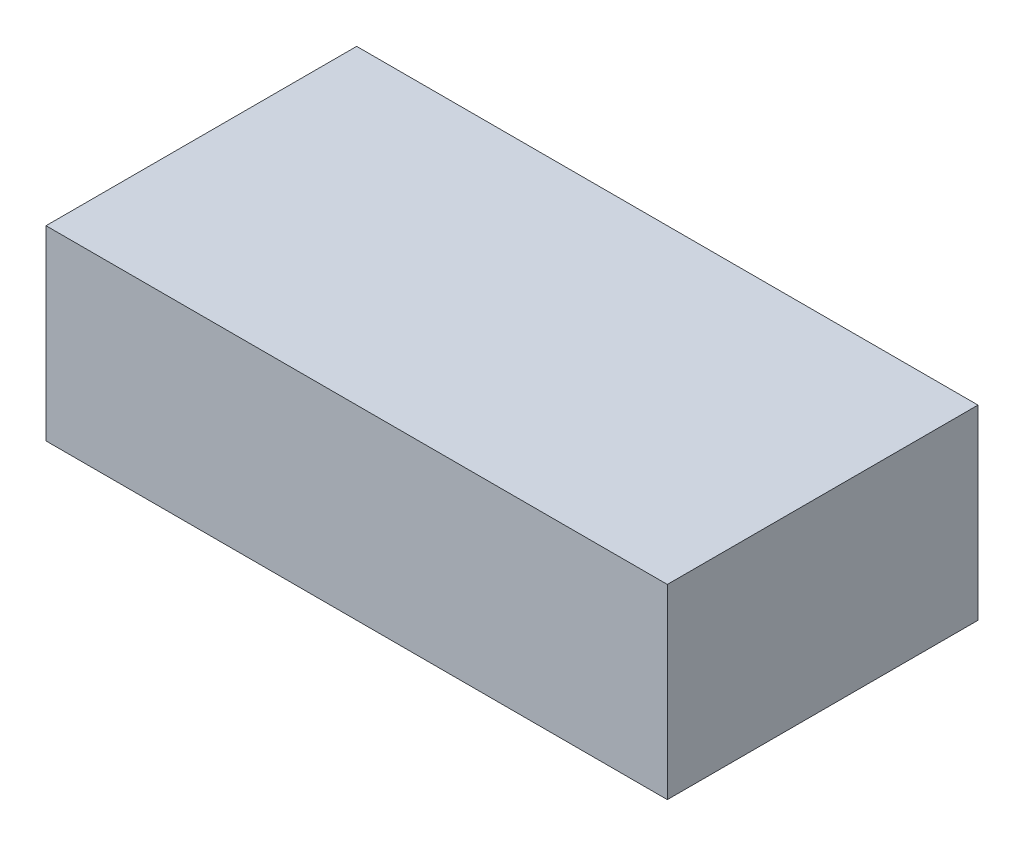
ISO-10303-21;
HEADER;
FILE_DESCRIPTION(('STEP AP214'),'2;1');
FILE_NAME('part.step','',(''),(''),'','','');
FILE_SCHEMA(('AUTOMOTIVE_DESIGN { 1 0 10303 214 1 1 1 1 }'));
ENDSEC;
DATA;
#1=APPLICATION_CONTEXT('core data for automotive mechanical design processes');
#2=APPLICATION_PROTOCOL_DEFINITION('international standard','automotive_design',2000,#1);
#3=PRODUCT_CONTEXT('',#1,'mechanical');
#4=PRODUCT('Part','Part','',(#3));
#5=PRODUCT_RELATED_PRODUCT_CATEGORY('part','',(#4));
#6=PRODUCT_DEFINITION_FORMATION('','',#4);
#7=PRODUCT_DEFINITION_CONTEXT('part definition',#1,'design');
#8=PRODUCT_DEFINITION('design','',#6,#7);
#9=PRODUCT_DEFINITION_SHAPE('','',#8);
#10=(LENGTH_UNIT() NAMED_UNIT(*) SI_UNIT(.MILLI.,.METRE.));
#11=(NAMED_UNIT(*) PLANE_ANGLE_UNIT() SI_UNIT($,.RADIAN.));
#12=(NAMED_UNIT(*) SI_UNIT($,.STERADIAN.) SOLID_ANGLE_UNIT());
#13=UNCERTAINTY_MEASURE_WITH_UNIT(LENGTH_MEASURE(1.E-05),#10,'distance_accuracy_value','');
#14=(GEOMETRIC_REPRESENTATION_CONTEXT(3) GLOBAL_UNCERTAINTY_ASSIGNED_CONTEXT((#13)) GLOBAL_UNIT_ASSIGNED_CONTEXT((#10,
#11,#12)) REPRESENTATION_CONTEXT('',''));
#15=CARTESIAN_POINT('',(0.,0.,0.));
#16=DIRECTION('',(0.,0.,1.));
#17=DIRECTION('',(1.,0.,0.));
#18=AXIS2_PLACEMENT_3D('',#15,#16,#17);
#19=CARTESIAN_POINT('',(9.99999999999999,6.,-5.));
#20=DIRECTION('',(-1.,0.,0.));
#21=DIRECTION('',(0.,0.,1.));
#22=AXIS2_PLACEMENT_3D('',#19,#20,#21);
#23=PLANE('',#22);
#24=DIRECTION('',(0.,0.,-1.));
#25=VECTOR('',#24,1.);
#26=CARTESIAN_POINT('',(9.99999999999999,0.,-5.));
#27=LINE('',#26,#25);
#28=CARTESIAN_POINT('',(9.99999999999999,0.,5.));
#29=VERTEX_POINT('',#28);
#30=CARTESIAN_POINT('',(9.99999999999999,0.,-5.));
#31=VERTEX_POINT('',#30);
#32=EDGE_CURVE('E96',#29,#31,#27,.T.);
#33=ORIENTED_EDGE('',*,*,#32,.T.);
#34=DIRECTION('',(0.,-1.,0.));
#35=VECTOR('',#34,1.);
#36=CARTESIAN_POINT('',(9.99999999999999,6.,-5.));
#37=LINE('',#36,#35);
#38=CARTESIAN_POINT('',(9.99999999999999,6.,-5.));
#39=VERTEX_POINT('',#38);
#40=EDGE_CURVE('E11',#39,#31,#37,.T.);
#41=ORIENTED_EDGE('',*,*,#40,.F.);
#42=DIRECTION('',(0.,0.,-1.));
#43=VECTOR('',#42,1.);
#44=CARTESIAN_POINT('',(9.99999999999999,6.,-5.));
#45=LINE('',#44,#43);
#46=CARTESIAN_POINT('',(9.99999999999999,6.,5.));
#47=VERTEX_POINT('',#46);
#48=EDGE_CURVE('E84',#47,#39,#45,.T.);
#49=ORIENTED_EDGE('',*,*,#48,.F.);
#50=DIRECTION('',(0.,-1.,0.));
#51=VECTOR('',#50,1.);
#52=CARTESIAN_POINT('',(9.99999999999999,6.,5.));
#53=LINE('',#52,#51);
#54=EDGE_CURVE('E92',#47,#29,#53,.T.);
#55=ORIENTED_EDGE('',*,*,#54,.T.);
#56=EDGE_LOOP('',(#33,#41,#49,#55));
#57=FACE_BOUND('',#56,.T.);
#58=ADVANCED_FACE('F33',(#57),#23,.F.);
#59=CARTESIAN_POINT('',(-10.,6.,-5.));
#60=DIRECTION('',(0.,0.,1.));
#61=DIRECTION('',(1.,0.,0.));
#62=AXIS2_PLACEMENT_3D('',#59,#60,#61);
#63=PLANE('',#62);
#64=DIRECTION('',(-1.,0.,0.));
#65=VECTOR('',#64,1.);
#66=CARTESIAN_POINT('',(-10.,0.,-5.));
#67=LINE('',#66,#65);
#68=CARTESIAN_POINT('',(-10.,0.,-5.));
#69=VERTEX_POINT('',#68);
#70=EDGE_CURVE('E88',#31,#69,#67,.T.);
#71=ORIENTED_EDGE('',*,*,#70,.T.);
#72=DIRECTION('',(0.,-1.,0.));
#73=VECTOR('',#72,1.);
#74=CARTESIAN_POINT('',(-10.,6.,-5.));
#75=LINE('',#74,#73);
#76=CARTESIAN_POINT('',(-10.,6.,-5.));
#77=VERTEX_POINT('',#76);
#78=EDGE_CURVE('E41',#77,#69,#75,.T.);
#79=ORIENTED_EDGE('',*,*,#78,.F.);
#80=DIRECTION('',(-1.,0.,0.));
#81=VECTOR('',#80,1.);
#82=CARTESIAN_POINT('',(-10.,6.,-5.));
#83=LINE('',#82,#81);
#84=EDGE_CURVE('E79',#39,#77,#83,.T.);
#85=ORIENTED_EDGE('',*,*,#84,.F.);
#86=ORIENTED_EDGE('',*,*,#40,.T.);
#87=EDGE_LOOP('',(#71,#79,#85,#86));
#88=FACE_BOUND('',#87,.T.);
#89=ADVANCED_FACE('F87',(#88),#63,.F.);
#90=CARTESIAN_POINT('',(-10.,6.,-5.));
#91=DIRECTION('',(1.,0.,0.));
#92=DIRECTION('',(0.,0.,-1.));
#93=AXIS2_PLACEMENT_3D('',#90,#91,#92);
#94=PLANE('',#93);
#95=DIRECTION('',(0.,0.,1.));
#96=VECTOR('',#95,1.);
#97=CARTESIAN_POINT('',(-10.,0.,-5.));
#98=LINE('',#97,#96);
#99=CARTESIAN_POINT('',(-10.,0.,5.));
#100=VERTEX_POINT('',#99);
#101=EDGE_CURVE('E66',#69,#100,#98,.T.);
#102=ORIENTED_EDGE('',*,*,#101,.T.);
#103=DIRECTION('',(0.,-1.,0.));
#104=VECTOR('',#103,1.);
#105=CARTESIAN_POINT('',(-10.,6.,5.));
#106=LINE('',#105,#104);
#107=CARTESIAN_POINT('',(-10.,6.,5.));
#108=VERTEX_POINT('',#107);
#109=EDGE_CURVE('E89',#108,#100,#106,.T.);
#110=ORIENTED_EDGE('',*,*,#109,.F.);
#111=DIRECTION('',(0.,0.,1.));
#112=VECTOR('',#111,1.);
#113=CARTESIAN_POINT('',(-10.,6.,-5.));
#114=LINE('',#113,#112);
#115=EDGE_CURVE('E82',#77,#108,#114,.T.);
#116=ORIENTED_EDGE('',*,*,#115,.F.);
#117=ORIENTED_EDGE('',*,*,#78,.T.);
#118=EDGE_LOOP('',(#102,#110,#116,#117));
#119=FACE_BOUND('',#118,.T.);
#120=ADVANCED_FACE('F90',(#119),#94,.F.);
#121=CARTESIAN_POINT('',(-10.,6.,5.));
#122=DIRECTION('',(0.,0.,-1.));
#123=DIRECTION('',(-1.,0.,0.));
#124=AXIS2_PLACEMENT_3D('',#121,#122,#123);
#125=PLANE('',#124);
#126=DIRECTION('',(1.,0.,0.));
#127=VECTOR('',#126,1.);
#128=CARTESIAN_POINT('',(-10.,0.,5.));
#129=LINE('',#128,#127);
#130=EDGE_CURVE('E72',#100,#29,#129,.T.);
#131=ORIENTED_EDGE('',*,*,#130,.T.);
#132=ORIENTED_EDGE('',*,*,#54,.F.);
#133=DIRECTION('',(1.,0.,0.));
#134=VECTOR('',#133,1.);
#135=CARTESIAN_POINT('',(-10.,6.,5.));
#136=LINE('',#135,#134);
#137=EDGE_CURVE('E49',#108,#47,#136,.T.);
#138=ORIENTED_EDGE('',*,*,#137,.F.);
#139=ORIENTED_EDGE('',*,*,#109,.T.);
#140=EDGE_LOOP('',(#131,#132,#138,#139));
#141=FACE_BOUND('',#140,.T.);
#142=ADVANCED_FACE('F103',(#141),#125,.F.);
#143=CARTESIAN_POINT('',(0.,6.,0.));
#144=DIRECTION('',(0.,1.,0.));
#145=DIRECTION('',(0.,0.,1.));
#146=AXIS2_PLACEMENT_3D('',#143,#144,#145);
#147=PLANE('',#146);
#148=ORIENTED_EDGE('',*,*,#48,.T.);
#149=ORIENTED_EDGE('',*,*,#84,.T.);
#150=ORIENTED_EDGE('',*,*,#115,.T.);
#151=ORIENTED_EDGE('',*,*,#137,.T.);
#152=EDGE_LOOP('',(#148,#149,#150,#151));
#153=FACE_BOUND('',#152,.T.);
#154=ADVANCED_FACE('F80',(#153),#147,.T.);
#155=CARTESIAN_POINT('',(0.,0.,0.));
#156=DIRECTION('',(0.,1.,0.));
#157=DIRECTION('',(0.,0.,1.));
#158=AXIS2_PLACEMENT_3D('',#155,#156,#157);
#159=PLANE('',#158);
#160=ORIENTED_EDGE('',*,*,#32,.F.);
#161=ORIENTED_EDGE('',*,*,#130,.F.);
#162=ORIENTED_EDGE('',*,*,#101,.F.);
#163=ORIENTED_EDGE('',*,*,#70,.F.);
#164=EDGE_LOOP('',(#160,#161,#162,#163));
#165=FACE_BOUND('',#164,.T.);
#166=ADVANCED_FACE('F106',(#165),#159,.F.);
#167=CLOSED_SHELL('',(#58,#89,#120,#142,#154,#166));
#168=MANIFOLD_SOLID_BREP('B2',#167);
#169=ADVANCED_BREP_SHAPE_REPRESENTATION('',(#18,#168),#14);
#170=SHAPE_DEFINITION_REPRESENTATION(#9,#169);
ENDSEC;
END-ISO-10303-21;
